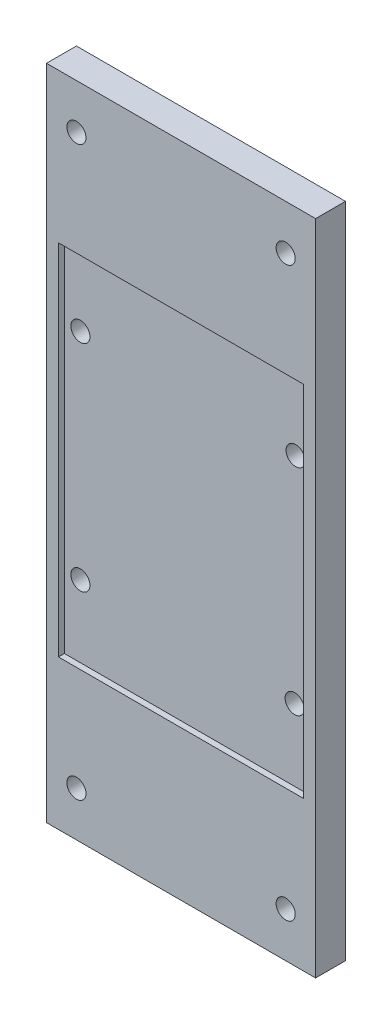
ISO-10303-21;
HEADER;
FILE_DESCRIPTION(('STEP AP214'),'2;1');
FILE_NAME('part.step','',(''),(''),'','','');
FILE_SCHEMA(('AUTOMOTIVE_DESIGN { 1 0 10303 214 1 1 1 1 }'));
ENDSEC;
DATA;
#1=APPLICATION_CONTEXT('core data for automotive mechanical design processes');
#2=APPLICATION_PROTOCOL_DEFINITION('international standard','automotive_design',2000,#1);
#3=PRODUCT_CONTEXT('',#1,'mechanical');
#4=PRODUCT('Part','Part','',(#3));
#5=PRODUCT_RELATED_PRODUCT_CATEGORY('part','',(#4));
#6=PRODUCT_DEFINITION_FORMATION('','',#4);
#7=PRODUCT_DEFINITION_CONTEXT('part definition',#1,'design');
#8=PRODUCT_DEFINITION('design','',#6,#7);
#9=PRODUCT_DEFINITION_SHAPE('','',#8);
#10=(LENGTH_UNIT() NAMED_UNIT(*) SI_UNIT(.MILLI.,.METRE.));
#11=(NAMED_UNIT(*) PLANE_ANGLE_UNIT() SI_UNIT($,.RADIAN.));
#12=(NAMED_UNIT(*) SI_UNIT($,.STERADIAN.) SOLID_ANGLE_UNIT());
#13=UNCERTAINTY_MEASURE_WITH_UNIT(LENGTH_MEASURE(1.E-05),#10,'distance_accuracy_value','');
#14=(GEOMETRIC_REPRESENTATION_CONTEXT(3) GLOBAL_UNCERTAINTY_ASSIGNED_CONTEXT((#13)) GLOBAL_UNIT_ASSIGNED_CONTEXT((#10,
#11,#12)) REPRESENTATION_CONTEXT('',''));
#15=CARTESIAN_POINT('',(0.,0.,0.));
#16=DIRECTION('',(0.,0.,1.));
#17=DIRECTION('',(1.,0.,0.));
#18=AXIS2_PLACEMENT_3D('',#15,#16,#17);
#19=CARTESIAN_POINT('',(-22.5,-50.,5.));
#20=DIRECTION('',(1.,0.,0.));
#21=DIRECTION('',(0.,0.,-1.));
#22=AXIS2_PLACEMENT_3D('',#19,#20,#21);
#23=PLANE('',#22);
#24=DIRECTION('',(0.,-1.,0.));
#25=VECTOR('',#24,1.);
#26=CARTESIAN_POINT('',(-22.5,-50.,0.));
#27=LINE('',#26,#25);
#28=CARTESIAN_POINT('',(-22.5,55.,0.));
#29=VERTEX_POINT('',#28);
#30=CARTESIAN_POINT('',(-22.5,-55.,0.));
#31=VERTEX_POINT('',#30);
#32=EDGE_CURVE('E127',#29,#31,#27,.T.);
#33=ORIENTED_EDGE('',*,*,#32,.T.);
#34=DIRECTION('',(0.,0.,1.));
#35=VECTOR('',#34,1.);
#36=CARTESIAN_POINT('',(-22.5,-55.,0.));
#37=LINE('',#36,#35);
#38=CARTESIAN_POINT('',(-22.5,-55.,5.));
#39=VERTEX_POINT('',#38);
#40=EDGE_CURVE('E152',#31,#39,#37,.T.);
#41=ORIENTED_EDGE('',*,*,#40,.T.);
#42=DIRECTION('',(0.,-1.,0.));
#43=VECTOR('',#42,1.);
#44=CARTESIAN_POINT('',(-22.5,-50.,5.));
#45=LINE('',#44,#43);
#46=CARTESIAN_POINT('',(-22.5,55.,5.));
#47=VERTEX_POINT('',#46);
#48=EDGE_CURVE('E53',#47,#39,#45,.T.);
#49=ORIENTED_EDGE('',*,*,#48,.F.);
#50=DIRECTION('',(0.,0.,1.));
#51=VECTOR('',#50,1.);
#52=CARTESIAN_POINT('',(-22.5,55.,0.));
#53=LINE('',#52,#51);
#54=EDGE_CURVE('E137',#29,#47,#53,.T.);
#55=ORIENTED_EDGE('',*,*,#54,.F.);
#56=EDGE_LOOP('',(#33,#41,#49,#55));
#57=FACE_BOUND('',#56,.T.);
#58=ADVANCED_FACE('F44',(#57),#23,.F.);
#59=CARTESIAN_POINT('',(22.5,-50.,5.));
#60=DIRECTION('',(-1.,0.,0.));
#61=DIRECTION('',(0.,0.,1.));
#62=AXIS2_PLACEMENT_3D('',#59,#60,#61);
#63=PLANE('',#62);
#64=DIRECTION('',(0.,1.,0.));
#65=VECTOR('',#64,1.);
#66=CARTESIAN_POINT('',(22.5,-50.,0.));
#67=LINE('',#66,#65);
#68=CARTESIAN_POINT('',(22.5,-55.,0.));
#69=VERTEX_POINT('',#68);
#70=CARTESIAN_POINT('',(22.5,55.,0.));
#71=VERTEX_POINT('',#70);
#72=EDGE_CURVE('E112',#69,#71,#67,.T.);
#73=ORIENTED_EDGE('',*,*,#72,.T.);
#74=DIRECTION('',(0.,0.,1.));
#75=VECTOR('',#74,1.);
#76=CARTESIAN_POINT('',(22.5,55.,0.));
#77=LINE('',#76,#75);
#78=CARTESIAN_POINT('',(22.5,55.,5.));
#79=VERTEX_POINT('',#78);
#80=EDGE_CURVE('E120',#71,#79,#77,.T.);
#81=ORIENTED_EDGE('',*,*,#80,.T.);
#82=DIRECTION('',(0.,1.,0.));
#83=VECTOR('',#82,1.);
#84=CARTESIAN_POINT('',(22.5,-50.,5.));
#85=LINE('',#84,#83);
#86=CARTESIAN_POINT('',(22.5,-55.,5.));
#87=VERTEX_POINT('',#86);
#88=EDGE_CURVE('E11',#87,#79,#85,.T.);
#89=ORIENTED_EDGE('',*,*,#88,.F.);
#90=DIRECTION('',(0.,0.,1.));
#91=VECTOR('',#90,1.);
#92=CARTESIAN_POINT('',(22.5,-55.,0.));
#93=LINE('',#92,#91);
#94=EDGE_CURVE('E119',#69,#87,#93,.T.);
#95=ORIENTED_EDGE('',*,*,#94,.F.);
#96=EDGE_LOOP('',(#73,#81,#89,#95));
#97=FACE_BOUND('',#96,.T.);
#98=ADVANCED_FACE('F116',(#97),#63,.F.);
#99=CARTESIAN_POINT('',(0.,0.,5.));
#100=DIRECTION('',(0.,0.,1.));
#101=DIRECTION('',(1.,0.,0.));
#102=AXIS2_PLACEMENT_3D('',#99,#100,#101);
#103=PLANE('',#102);
#104=CARTESIAN_POINT('',(-17.5,-47.5,5.));
#105=DIRECTION('',(0.,0.,1.));
#106=DIRECTION('',(1.,0.,0.));
#107=AXIS2_PLACEMENT_3D('',#104,#105,#106);
#108=CIRCLE('',#107,1.6);
#109=CARTESIAN_POINT('',(-15.9,-47.5,5.));
#110=VERTEX_POINT('',#109);
#111=EDGE_CURVE('E240',#110,#110,#108,.T.);
#112=ORIENTED_EDGE('',*,*,#111,.F.);
#113=EDGE_LOOP('',(#112));
#114=FACE_BOUND('',#113,.T.);
#115=CARTESIAN_POINT('',(17.5,-47.5,5.));
#116=DIRECTION('',(0.,0.,1.));
#117=DIRECTION('',(1.,0.,0.));
#118=AXIS2_PLACEMENT_3D('',#115,#116,#117);
#119=CIRCLE('',#118,1.6);
#120=CARTESIAN_POINT('',(19.1,-47.5,5.));
#121=VERTEX_POINT('',#120);
#122=EDGE_CURVE('E245',#121,#121,#119,.T.);
#123=ORIENTED_EDGE('',*,*,#122,.F.);
#124=EDGE_LOOP('',(#123));
#125=FACE_BOUND('',#124,.T.);
#126=CARTESIAN_POINT('',(17.5,47.5,5.));
#127=DIRECTION('',(0.,0.,1.));
#128=DIRECTION('',(1.,0.,0.));
#129=AXIS2_PLACEMENT_3D('',#126,#127,#128);
#130=CIRCLE('',#129,1.6);
#131=CARTESIAN_POINT('',(19.1,47.5,5.));
#132=VERTEX_POINT('',#131);
#133=EDGE_CURVE('E250',#132,#132,#130,.T.);
#134=ORIENTED_EDGE('',*,*,#133,.F.);
#135=EDGE_LOOP('',(#134));
#136=FACE_BOUND('',#135,.T.);
#137=CARTESIAN_POINT('',(-17.5,47.5,5.));
#138=DIRECTION('',(0.,0.,1.));
#139=DIRECTION('',(1.,0.,0.));
#140=AXIS2_PLACEMENT_3D('',#137,#138,#139);
#141=CIRCLE('',#140,1.6);
#142=CARTESIAN_POINT('',(-15.9,47.5,5.));
#143=VERTEX_POINT('',#142);
#144=EDGE_CURVE('E147',#143,#143,#141,.T.);
#145=ORIENTED_EDGE('',*,*,#144,.F.);
#146=EDGE_LOOP('',(#145));
#147=FACE_BOUND('',#146,.T.);
#148=DIRECTION('',(0.,-1.,0.));
#149=VECTOR('',#148,1.);
#150=CARTESIAN_POINT('',(-20.5,-30.,5.));
#151=LINE('',#150,#149);
#152=CARTESIAN_POINT('',(-20.5,30.,5.));
#153=VERTEX_POINT('',#152);
#154=CARTESIAN_POINT('',(-20.5,-30.,5.));
#155=VERTEX_POINT('',#154);
#156=EDGE_CURVE('E65',#153,#155,#151,.T.);
#157=ORIENTED_EDGE('',*,*,#156,.F.);
#158=DIRECTION('',(-1.,0.,0.));
#159=VECTOR('',#158,1.);
#160=CARTESIAN_POINT('',(20.5,30.,5.));
#161=LINE('',#160,#159);
#162=CARTESIAN_POINT('',(20.5,30.,5.));
#163=VERTEX_POINT('',#162);
#164=EDGE_CURVE('E169',#163,#153,#161,.T.);
#165=ORIENTED_EDGE('',*,*,#164,.F.);
#166=DIRECTION('',(0.,1.,0.));
#167=VECTOR('',#166,1.);
#168=CARTESIAN_POINT('',(20.5,-30.,5.));
#169=LINE('',#168,#167);
#170=CARTESIAN_POINT('',(20.5,-30.,5.));
#171=VERTEX_POINT('',#170);
#172=EDGE_CURVE('E190',#171,#163,#169,.T.);
#173=ORIENTED_EDGE('',*,*,#172,.F.);
#174=DIRECTION('',(1.,0.,0.));
#175=VECTOR('',#174,1.);
#176=CARTESIAN_POINT('',(20.5,-30.,5.));
#177=LINE('',#176,#175);
#178=EDGE_CURVE('E182',#155,#171,#177,.T.);
#179=ORIENTED_EDGE('',*,*,#178,.F.);
#180=EDGE_LOOP('',(#157,#165,#173,#179));
#181=FACE_BOUND('',#180,.T.);
#182=ORIENTED_EDGE('',*,*,#48,.T.);
#183=DIRECTION('',(1.,0.,0.));
#184=VECTOR('',#183,1.);
#185=CARTESIAN_POINT('',(22.5,-55.,5.));
#186=LINE('',#185,#184);
#187=EDGE_CURVE('E141',#39,#87,#186,.T.);
#188=ORIENTED_EDGE('',*,*,#187,.T.);
#189=ORIENTED_EDGE('',*,*,#88,.T.);
#190=DIRECTION('',(-1.,0.,0.));
#191=VECTOR('',#190,1.);
#192=CARTESIAN_POINT('',(22.5,55.,5.));
#193=LINE('',#192,#191);
#194=EDGE_CURVE('E131',#79,#47,#193,.T.);
#195=ORIENTED_EDGE('',*,*,#194,.T.);
#196=EDGE_LOOP('',(#182,#188,#189,#195));
#197=FACE_BOUND('',#196,.T.);
#198=ADVANCED_FACE('F288',(#114,#125,#136,#147,#181,#197),#103,.T.);
#199=CARTESIAN_POINT('',(0.,0.,0.));
#200=DIRECTION('',(0.,0.,1.));
#201=DIRECTION('',(1.,0.,0.));
#202=AXIS2_PLACEMENT_3D('',#199,#200,#201);
#203=PLANE('',#202);
#204=CARTESIAN_POINT('',(18.1664681749952,18.,0.));
#205=DIRECTION('',(0.,0.,1.));
#206=DIRECTION('',(1.,0.,0.));
#207=AXIS2_PLACEMENT_3D('',#204,#205,#206);
#208=CIRCLE('',#207,1.6);
#209=CARTESIAN_POINT('',(19.7664681749952,18.,0.));
#210=VERTEX_POINT('',#209);
#211=EDGE_CURVE('E48',#210,#210,#208,.T.);
#212=ORIENTED_EDGE('',*,*,#211,.T.);
#213=EDGE_LOOP('',(#212));
#214=FACE_BOUND('',#213,.T.);
#215=CARTESIAN_POINT('',(18.,-18.,0.));
#216=DIRECTION('',(0.,0.,1.));
#217=DIRECTION('',(1.,0.,0.));
#218=AXIS2_PLACEMENT_3D('',#215,#216,#217);
#219=CIRCLE('',#218,1.6);
#220=CARTESIAN_POINT('',(19.6,-18.,0.));
#221=VERTEX_POINT('',#220);
#222=EDGE_CURVE('E229',#221,#221,#219,.T.);
#223=ORIENTED_EDGE('',*,*,#222,.T.);
#224=EDGE_LOOP('',(#223));
#225=FACE_BOUND('',#224,.T.);
#226=CARTESIAN_POINT('',(-17.8335318250048,-18.,0.));
#227=DIRECTION('',(0.,0.,1.));
#228=DIRECTION('',(1.,0.,0.));
#229=AXIS2_PLACEMENT_3D('',#226,#227,#228);
#230=CIRCLE('',#229,1.6);
#231=CARTESIAN_POINT('',(-16.2335318250048,-18.,0.));
#232=VERTEX_POINT('',#231);
#233=EDGE_CURVE('E228',#232,#232,#230,.T.);
#234=ORIENTED_EDGE('',*,*,#233,.T.);
#235=EDGE_LOOP('',(#234));
#236=FACE_BOUND('',#235,.T.);
#237=CARTESIAN_POINT('',(-17.8335318250048,18.,0.));
#238=DIRECTION('',(0.,0.,1.));
#239=DIRECTION('',(1.,0.,0.));
#240=AXIS2_PLACEMENT_3D('',#237,#238,#239);
#241=CIRCLE('',#240,1.6);
#242=CARTESIAN_POINT('',(-16.2335318250048,18.,0.));
#243=VERTEX_POINT('',#242);
#244=EDGE_CURVE('E225',#243,#243,#241,.T.);
#245=ORIENTED_EDGE('',*,*,#244,.T.);
#246=EDGE_LOOP('',(#245));
#247=FACE_BOUND('',#246,.T.);
#248=CARTESIAN_POINT('',(-17.5,-47.5,0.));
#249=DIRECTION('',(0.,0.,1.));
#250=DIRECTION('',(1.,0.,0.));
#251=AXIS2_PLACEMENT_3D('',#248,#249,#250);
#252=CIRCLE('',#251,1.6);
#253=CARTESIAN_POINT('',(-15.9,-47.5,0.));
#254=VERTEX_POINT('',#253);
#255=EDGE_CURVE('E159',#254,#254,#252,.T.);
#256=ORIENTED_EDGE('',*,*,#255,.T.);
#257=EDGE_LOOP('',(#256));
#258=FACE_BOUND('',#257,.T.);
#259=CARTESIAN_POINT('',(17.5,-47.5,0.));
#260=DIRECTION('',(0.,0.,1.));
#261=DIRECTION('',(1.,0.,0.));
#262=AXIS2_PLACEMENT_3D('',#259,#260,#261);
#263=CIRCLE('',#262,1.6);
#264=CARTESIAN_POINT('',(19.1,-47.5,0.));
#265=VERTEX_POINT('',#264);
#266=EDGE_CURVE('E213',#265,#265,#263,.T.);
#267=ORIENTED_EDGE('',*,*,#266,.T.);
#268=EDGE_LOOP('',(#267));
#269=FACE_BOUND('',#268,.T.);
#270=CARTESIAN_POINT('',(17.5,47.5,0.));
#271=DIRECTION('',(0.,0.,1.));
#272=DIRECTION('',(1.,0.,0.));
#273=AXIS2_PLACEMENT_3D('',#270,#271,#272);
#274=CIRCLE('',#273,1.6);
#275=CARTESIAN_POINT('',(19.1,47.5,0.));
#276=VERTEX_POINT('',#275);
#277=EDGE_CURVE('E212',#276,#276,#274,.T.);
#278=ORIENTED_EDGE('',*,*,#277,.T.);
#279=EDGE_LOOP('',(#278));
#280=FACE_BOUND('',#279,.T.);
#281=CARTESIAN_POINT('',(-17.5,47.5,0.));
#282=DIRECTION('',(0.,0.,1.));
#283=DIRECTION('',(1.,0.,0.));
#284=AXIS2_PLACEMENT_3D('',#281,#282,#283);
#285=CIRCLE('',#284,1.6);
#286=CARTESIAN_POINT('',(-15.9,47.5,0.));
#287=VERTEX_POINT('',#286);
#288=EDGE_CURVE('E210',#287,#287,#285,.T.);
#289=ORIENTED_EDGE('',*,*,#288,.T.);
#290=EDGE_LOOP('',(#289));
#291=FACE_BOUND('',#290,.T.);
#292=ORIENTED_EDGE('',*,*,#32,.F.);
#293=DIRECTION('',(-1.,0.,0.));
#294=VECTOR('',#293,1.);
#295=CARTESIAN_POINT('',(22.5,55.,0.));
#296=LINE('',#295,#294);
#297=EDGE_CURVE('E135',#71,#29,#296,.T.);
#298=ORIENTED_EDGE('',*,*,#297,.F.);
#299=ORIENTED_EDGE('',*,*,#72,.F.);
#300=DIRECTION('',(1.,0.,0.));
#301=VECTOR('',#300,1.);
#302=CARTESIAN_POINT('',(22.5,-55.,0.));
#303=LINE('',#302,#301);
#304=EDGE_CURVE('E153',#31,#69,#303,.T.);
#305=ORIENTED_EDGE('',*,*,#304,.F.);
#306=EDGE_LOOP('',(#292,#298,#299,#305));
#307=FACE_BOUND('',#306,.T.);
#308=ADVANCED_FACE('F139',(#214,#225,#236,#247,#258,#269,#280,#291,#307),#203,.F.);
#309=CARTESIAN_POINT('',(-20.5,-30.,4.));
#310=DIRECTION('',(-1.,0.,0.));
#311=DIRECTION('',(0.,0.,1.));
#312=AXIS2_PLACEMENT_3D('',#309,#310,#311);
#313=PLANE('',#312);
#314=ORIENTED_EDGE('',*,*,#156,.T.);
#315=DIRECTION('',(0.,0.,1.));
#316=VECTOR('',#315,1.);
#317=CARTESIAN_POINT('',(-20.5,-30.,4.));
#318=LINE('',#317,#316);
#319=CARTESIAN_POINT('',(-20.5,-30.,4.));
#320=VERTEX_POINT('',#319);
#321=EDGE_CURVE('E87',#320,#155,#318,.T.);
#322=ORIENTED_EDGE('',*,*,#321,.F.);
#323=DIRECTION('',(0.,-1.,0.));
#324=VECTOR('',#323,1.);
#325=CARTESIAN_POINT('',(-20.5,-30.,4.));
#326=LINE('',#325,#324);
#327=CARTESIAN_POINT('',(-20.5,30.,4.));
#328=VERTEX_POINT('',#327);
#329=EDGE_CURVE('E165',#328,#320,#326,.T.);
#330=ORIENTED_EDGE('',*,*,#329,.F.);
#331=DIRECTION('',(0.,0.,1.));
#332=VECTOR('',#331,1.);
#333=CARTESIAN_POINT('',(-20.5,30.,4.));
#334=LINE('',#333,#332);
#335=EDGE_CURVE('E68',#328,#153,#334,.T.);
#336=ORIENTED_EDGE('',*,*,#335,.T.);
#337=EDGE_LOOP('',(#314,#322,#330,#336));
#338=FACE_BOUND('',#337,.T.);
#339=ADVANCED_FACE('F278',(#338),#313,.F.);
#340=CARTESIAN_POINT('',(20.5,30.,4.));
#341=DIRECTION('',(0.,1.,0.));
#342=DIRECTION('',(-1.,0.,0.));
#343=AXIS2_PLACEMENT_3D('',#340,#341,#342);
#344=PLANE('',#343);
#345=ORIENTED_EDGE('',*,*,#164,.T.);
#346=ORIENTED_EDGE('',*,*,#335,.F.);
#347=DIRECTION('',(-1.,0.,0.));
#348=VECTOR('',#347,1.);
#349=CARTESIAN_POINT('',(20.5,30.,4.));
#350=LINE('',#349,#348);
#351=CARTESIAN_POINT('',(20.5,30.,4.));
#352=VERTEX_POINT('',#351);
#353=EDGE_CURVE('E180',#352,#328,#350,.T.);
#354=ORIENTED_EDGE('',*,*,#353,.F.);
#355=DIRECTION('',(0.,0.,1.));
#356=VECTOR('',#355,1.);
#357=CARTESIAN_POINT('',(20.5,30.,4.));
#358=LINE('',#357,#356);
#359=EDGE_CURVE('E193',#352,#163,#358,.T.);
#360=ORIENTED_EDGE('',*,*,#359,.T.);
#361=EDGE_LOOP('',(#345,#346,#354,#360));
#362=FACE_BOUND('',#361,.T.);
#363=ADVANCED_FACE('F285',(#362),#344,.F.);
#364=CARTESIAN_POINT('',(20.5,-30.,4.));
#365=DIRECTION('',(1.,0.,0.));
#366=DIRECTION('',(0.,0.,-1.));
#367=AXIS2_PLACEMENT_3D('',#364,#365,#366);
#368=PLANE('',#367);
#369=ORIENTED_EDGE('',*,*,#172,.T.);
#370=ORIENTED_EDGE('',*,*,#359,.F.);
#371=DIRECTION('',(0.,1.,0.));
#372=VECTOR('',#371,1.);
#373=CARTESIAN_POINT('',(20.5,-30.,4.));
#374=LINE('',#373,#372);
#375=CARTESIAN_POINT('',(20.5,-30.,4.));
#376=VERTEX_POINT('',#375);
#377=EDGE_CURVE('E173',#376,#352,#374,.T.);
#378=ORIENTED_EDGE('',*,*,#377,.F.);
#379=DIRECTION('',(0.,0.,1.));
#380=VECTOR('',#379,1.);
#381=CARTESIAN_POINT('',(20.5,-30.,4.));
#382=LINE('',#381,#380);
#383=EDGE_CURVE('E199',#376,#171,#382,.T.);
#384=ORIENTED_EDGE('',*,*,#383,.T.);
#385=EDGE_LOOP('',(#369,#370,#378,#384));
#386=FACE_BOUND('',#385,.T.);
#387=ADVANCED_FACE('F290',(#386),#368,.F.);
#388=CARTESIAN_POINT('',(20.5,-30.,4.));
#389=DIRECTION('',(0.,-1.,0.));
#390=DIRECTION('',(1.,0.,0.));
#391=AXIS2_PLACEMENT_3D('',#388,#389,#390);
#392=PLANE('',#391);
#393=ORIENTED_EDGE('',*,*,#178,.T.);
#394=ORIENTED_EDGE('',*,*,#383,.F.);
#395=DIRECTION('',(1.,0.,0.));
#396=VECTOR('',#395,1.);
#397=CARTESIAN_POINT('',(20.5,-30.,4.));
#398=LINE('',#397,#396);
#399=EDGE_CURVE('E166',#320,#376,#398,.T.);
#400=ORIENTED_EDGE('',*,*,#399,.F.);
#401=ORIENTED_EDGE('',*,*,#321,.T.);
#402=EDGE_LOOP('',(#393,#394,#400,#401));
#403=FACE_BOUND('',#402,.T.);
#404=ADVANCED_FACE('F273',(#403),#392,.F.);
#405=CARTESIAN_POINT('',(0.,0.,4.));
#406=DIRECTION('',(0.,0.,1.));
#407=DIRECTION('',(1.,0.,0.));
#408=AXIS2_PLACEMENT_3D('',#405,#406,#407);
#409=PLANE('',#408);
#410=CARTESIAN_POINT('',(18.1664681749952,18.,4.));
#411=DIRECTION('',(0.,0.,1.));
#412=DIRECTION('',(1.,0.,0.));
#413=AXIS2_PLACEMENT_3D('',#410,#411,#412);
#414=CIRCLE('',#413,1.6);
#415=CARTESIAN_POINT('',(19.7664681749952,18.,4.));
#416=VERTEX_POINT('',#415);
#417=EDGE_CURVE('E260',#416,#416,#414,.T.);
#418=ORIENTED_EDGE('',*,*,#417,.F.);
#419=EDGE_LOOP('',(#418));
#420=FACE_BOUND('',#419,.T.);
#421=CARTESIAN_POINT('',(18.,-18.,4.));
#422=DIRECTION('',(0.,0.,1.));
#423=DIRECTION('',(1.,0.,0.));
#424=AXIS2_PLACEMENT_3D('',#421,#422,#423);
#425=CIRCLE('',#424,1.6);
#426=CARTESIAN_POINT('',(19.6,-18.,4.));
#427=VERTEX_POINT('',#426);
#428=EDGE_CURVE('E262',#427,#427,#425,.T.);
#429=ORIENTED_EDGE('',*,*,#428,.F.);
#430=EDGE_LOOP('',(#429));
#431=FACE_BOUND('',#430,.T.);
#432=CARTESIAN_POINT('',(-17.8335318250048,-18.,4.));
#433=DIRECTION('',(0.,0.,1.));
#434=DIRECTION('',(1.,0.,0.));
#435=AXIS2_PLACEMENT_3D('',#432,#433,#434);
#436=CIRCLE('',#435,1.6);
#437=CARTESIAN_POINT('',(-16.2335318250048,-18.,4.));
#438=VERTEX_POINT('',#437);
#439=EDGE_CURVE('E257',#438,#438,#436,.T.);
#440=ORIENTED_EDGE('',*,*,#439,.F.);
#441=EDGE_LOOP('',(#440));
#442=FACE_BOUND('',#441,.T.);
#443=CARTESIAN_POINT('',(-17.8335318250048,18.,4.));
#444=DIRECTION('',(0.,0.,1.));
#445=DIRECTION('',(1.,0.,0.));
#446=AXIS2_PLACEMENT_3D('',#443,#444,#445);
#447=CIRCLE('',#446,1.6);
#448=CARTESIAN_POINT('',(-16.2335318250048,18.,4.));
#449=VERTEX_POINT('',#448);
#450=EDGE_CURVE('E227',#449,#449,#447,.T.);
#451=ORIENTED_EDGE('',*,*,#450,.F.);
#452=EDGE_LOOP('',(#451));
#453=FACE_BOUND('',#452,.T.);
#454=ORIENTED_EDGE('',*,*,#329,.T.);
#455=ORIENTED_EDGE('',*,*,#399,.T.);
#456=ORIENTED_EDGE('',*,*,#377,.T.);
#457=ORIENTED_EDGE('',*,*,#353,.T.);
#458=EDGE_LOOP('',(#454,#455,#456,#457));
#459=FACE_BOUND('',#458,.T.);
#460=ADVANCED_FACE('F275',(#420,#431,#442,#453,#459),#409,.T.);
#461=CARTESIAN_POINT('',(22.5,55.,0.));
#462=DIRECTION('',(0.,1.,0.));
#463=DIRECTION('',(0.,0.,1.));
#464=AXIS2_PLACEMENT_3D('',#461,#462,#463);
#465=PLANE('',#464);
#466=ORIENTED_EDGE('',*,*,#194,.F.);
#467=ORIENTED_EDGE('',*,*,#80,.F.);
#468=ORIENTED_EDGE('',*,*,#297,.T.);
#469=ORIENTED_EDGE('',*,*,#54,.T.);
#470=EDGE_LOOP('',(#466,#467,#468,#469));
#471=FACE_BOUND('',#470,.T.);
#472=ADVANCED_FACE('F128',(#471),#465,.T.);
#473=CARTESIAN_POINT('',(22.5,-55.,0.));
#474=DIRECTION('',(0.,-1.,0.));
#475=DIRECTION('',(0.,0.,-1.));
#476=AXIS2_PLACEMENT_3D('',#473,#474,#475);
#477=PLANE('',#476);
#478=ORIENTED_EDGE('',*,*,#187,.F.);
#479=ORIENTED_EDGE('',*,*,#40,.F.);
#480=ORIENTED_EDGE('',*,*,#304,.T.);
#481=ORIENTED_EDGE('',*,*,#94,.T.);
#482=EDGE_LOOP('',(#478,#479,#480,#481));
#483=FACE_BOUND('',#482,.T.);
#484=ADVANCED_FACE('F303',(#483),#477,.T.);
#485=CARTESIAN_POINT('',(-17.5,47.5,-5.));
#486=DIRECTION('',(0.,0.,1.));
#487=DIRECTION('',(1.,0.,0.));
#488=AXIS2_PLACEMENT_3D('',#485,#486,#487);
#489=CYLINDRICAL_SURFACE('',#488,1.6);
#490=ORIENTED_EDGE('',*,*,#144,.T.);
#491=EDGE_LOOP('',(#490));
#492=FACE_BOUND('',#491,.T.);
#493=ORIENTED_EDGE('',*,*,#288,.F.);
#494=EDGE_LOOP('',(#493));
#495=FACE_BOUND('',#494,.T.);
#496=ADVANCED_FACE('F332',(#492,#495),#489,.F.);
#497=CARTESIAN_POINT('',(17.5,47.5,-5.));
#498=DIRECTION('',(0.,0.,1.));
#499=DIRECTION('',(1.,0.,0.));
#500=AXIS2_PLACEMENT_3D('',#497,#498,#499);
#501=CYLINDRICAL_SURFACE('',#500,1.6);
#502=ORIENTED_EDGE('',*,*,#133,.T.);
#503=EDGE_LOOP('',(#502));
#504=FACE_BOUND('',#503,.T.);
#505=ORIENTED_EDGE('',*,*,#277,.F.);
#506=EDGE_LOOP('',(#505));
#507=FACE_BOUND('',#506,.T.);
#508=ADVANCED_FACE('F333',(#504,#507),#501,.F.);
#509=CARTESIAN_POINT('',(17.5,-47.5,-5.));
#510=DIRECTION('',(0.,0.,1.));
#511=DIRECTION('',(1.,0.,0.));
#512=AXIS2_PLACEMENT_3D('',#509,#510,#511);
#513=CYLINDRICAL_SURFACE('',#512,1.6);
#514=ORIENTED_EDGE('',*,*,#122,.T.);
#515=EDGE_LOOP('',(#514));
#516=FACE_BOUND('',#515,.T.);
#517=ORIENTED_EDGE('',*,*,#266,.F.);
#518=EDGE_LOOP('',(#517));
#519=FACE_BOUND('',#518,.T.);
#520=ADVANCED_FACE('F342',(#516,#519),#513,.F.);
#521=CARTESIAN_POINT('',(-17.5,-47.5,-5.));
#522=DIRECTION('',(0.,0.,1.));
#523=DIRECTION('',(1.,0.,0.));
#524=AXIS2_PLACEMENT_3D('',#521,#522,#523);
#525=CYLINDRICAL_SURFACE('',#524,1.6);
#526=ORIENTED_EDGE('',*,*,#111,.T.);
#527=EDGE_LOOP('',(#526));
#528=FACE_BOUND('',#527,.T.);
#529=ORIENTED_EDGE('',*,*,#255,.F.);
#530=EDGE_LOOP('',(#529));
#531=FACE_BOUND('',#530,.T.);
#532=ADVANCED_FACE('F340',(#528,#531),#525,.F.);
#533=CARTESIAN_POINT('',(-17.8335318250048,18.,-6.));
#534=DIRECTION('',(0.,0.,1.));
#535=DIRECTION('',(1.,0.,0.));
#536=AXIS2_PLACEMENT_3D('',#533,#534,#535);
#537=CYLINDRICAL_SURFACE('',#536,1.6);
#538=ORIENTED_EDGE('',*,*,#450,.T.);
#539=EDGE_LOOP('',(#538));
#540=FACE_BOUND('',#539,.T.);
#541=ORIENTED_EDGE('',*,*,#244,.F.);
#542=EDGE_LOOP('',(#541));
#543=FACE_BOUND('',#542,.T.);
#544=ADVANCED_FACE('F338',(#540,#543),#537,.F.);
#545=CARTESIAN_POINT('',(-17.8335318250048,-18.,-6.));
#546=DIRECTION('',(0.,0.,1.));
#547=DIRECTION('',(1.,0.,0.));
#548=AXIS2_PLACEMENT_3D('',#545,#546,#547);
#549=CYLINDRICAL_SURFACE('',#548,1.6);
#550=ORIENTED_EDGE('',*,*,#439,.T.);
#551=EDGE_LOOP('',(#550));
#552=FACE_BOUND('',#551,.T.);
#553=ORIENTED_EDGE('',*,*,#233,.F.);
#554=EDGE_LOOP('',(#553));
#555=FACE_BOUND('',#554,.T.);
#556=ADVANCED_FACE('F266',(#552,#555),#549,.F.);
#557=CARTESIAN_POINT('',(18.,-18.,-6.));
#558=DIRECTION('',(0.,0.,1.));
#559=DIRECTION('',(1.,0.,0.));
#560=AXIS2_PLACEMENT_3D('',#557,#558,#559);
#561=CYLINDRICAL_SURFACE('',#560,1.6);
#562=ORIENTED_EDGE('',*,*,#428,.T.);
#563=EDGE_LOOP('',(#562));
#564=FACE_BOUND('',#563,.T.);
#565=ORIENTED_EDGE('',*,*,#222,.F.);
#566=EDGE_LOOP('',(#565));
#567=FACE_BOUND('',#566,.T.);
#568=ADVANCED_FACE('F351',(#564,#567),#561,.F.);
#569=CARTESIAN_POINT('',(18.1664681749952,18.,-6.));
#570=DIRECTION('',(0.,0.,1.));
#571=DIRECTION('',(1.,0.,0.));
#572=AXIS2_PLACEMENT_3D('',#569,#570,#571);
#573=CYLINDRICAL_SURFACE('',#572,1.6);
#574=ORIENTED_EDGE('',*,*,#417,.T.);
#575=EDGE_LOOP('',(#574));
#576=FACE_BOUND('',#575,.T.);
#577=ORIENTED_EDGE('',*,*,#211,.F.);
#578=EDGE_LOOP('',(#577));
#579=FACE_BOUND('',#578,.T.);
#580=ADVANCED_FACE('F352',(#576,#579),#573,.F.);
#581=CLOSED_SHELL('',(#58,#98,#198,#308,#339,#363,#387,#404,#460,#472,#484,#496,#508,#520,#532,
#544,#556,#568,#580));
#582=MANIFOLD_SOLID_BREP('B2',#581);
#583=ADVANCED_BREP_SHAPE_REPRESENTATION('',(#18,#582),#14);
#584=SHAPE_DEFINITION_REPRESENTATION(#9,#583);
ENDSEC;
END-ISO-10303-21;
